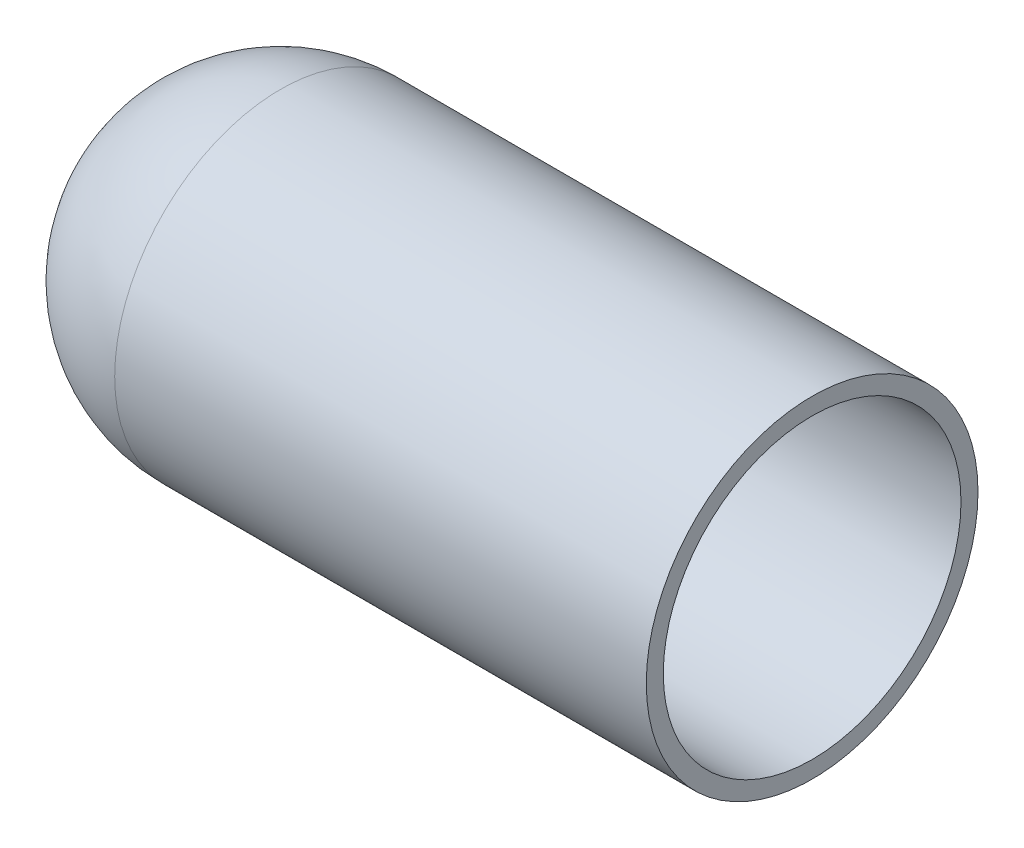
ISO-10303-21;
HEADER;
FILE_DESCRIPTION(('STEP AP214'),'2;1');
FILE_NAME('part.step','',(''),(''),'','','');
FILE_SCHEMA(('AUTOMOTIVE_DESIGN { 1 0 10303 214 1 1 1 1 }'));
ENDSEC;
DATA;
#1=APPLICATION_CONTEXT('core data for automotive mechanical design processes');
#2=APPLICATION_PROTOCOL_DEFINITION('international standard','automotive_design',2000,#1);
#3=PRODUCT_CONTEXT('',#1,'mechanical');
#4=PRODUCT('Part','Part','',(#3));
#5=PRODUCT_RELATED_PRODUCT_CATEGORY('part','',(#4));
#6=PRODUCT_DEFINITION_FORMATION('','',#4);
#7=PRODUCT_DEFINITION_CONTEXT('part definition',#1,'design');
#8=PRODUCT_DEFINITION('design','',#6,#7);
#9=PRODUCT_DEFINITION_SHAPE('','',#8);
#10=(LENGTH_UNIT() NAMED_UNIT(*) SI_UNIT(.MILLI.,.METRE.));
#11=(NAMED_UNIT(*) PLANE_ANGLE_UNIT() SI_UNIT($,.RADIAN.));
#12=(NAMED_UNIT(*) SI_UNIT($,.STERADIAN.) SOLID_ANGLE_UNIT());
#13=UNCERTAINTY_MEASURE_WITH_UNIT(LENGTH_MEASURE(1.E-05),#10,'distance_accuracy_value','');
#14=(GEOMETRIC_REPRESENTATION_CONTEXT(3) GLOBAL_UNCERTAINTY_ASSIGNED_CONTEXT((#13)) GLOBAL_UNIT_ASSIGNED_CONTEXT((#10,
#11,#12)) REPRESENTATION_CONTEXT('',''));
#15=CARTESIAN_POINT('',(0.,0.,0.));
#16=DIRECTION('',(0.,0.,1.));
#17=DIRECTION('',(1.,0.,0.));
#18=AXIS2_PLACEMENT_3D('',#15,#16,#17);
#19=CARTESIAN_POINT('',(15.0900471736981,0.,-9.75));
#20=DIRECTION('',(1.,0.,0.));
#21=DIRECTION('',(0.,0.,-1.));
#22=AXIS2_PLACEMENT_3D('',#19,#20,#21);
#23=PLANE('',#22);
#24=CARTESIAN_POINT('',(15.0900471736981,0.,0.));
#25=DIRECTION('',(1.,0.,0.));
#26=DIRECTION('',(0.,0.,-1.));
#27=AXIS2_PLACEMENT_3D('',#24,#25,#26);
#28=CIRCLE('',#27,8.75);
#29=CARTESIAN_POINT('',(15.0900471736981,0.,-8.75));
#30=VERTEX_POINT('',#29);
#31=EDGE_CURVE('E41',#30,#30,#28,.F.);
#32=ORIENTED_EDGE('',*,*,#31,.T.);
#33=EDGE_LOOP('',(#32));
#34=FACE_BOUND('',#33,.T.);
#35=CARTESIAN_POINT('',(15.0900471736981,0.,0.));
#36=DIRECTION('',(-1.,0.,0.));
#37=DIRECTION('',(0.,0.,1.));
#38=AXIS2_PLACEMENT_3D('',#35,#36,#37);
#39=CIRCLE('',#38,9.75);
#40=CARTESIAN_POINT('',(15.0900471736981,0.,9.75));
#41=VERTEX_POINT('',#40);
#42=EDGE_CURVE('E10',#41,#41,#39,.T.);
#43=ORIENTED_EDGE('',*,*,#42,.F.);
#44=EDGE_LOOP('',(#43));
#45=FACE_BOUND('',#44,.T.);
#46=ADVANCED_FACE('F31',(#34,#45),#23,.T.);
#47=CARTESIAN_POINT('',(-16.1599528263019,0.,0.));
#48=DIRECTION('',(-1.,0.,0.));
#49=DIRECTION('',(0.,0.,1.));
#50=AXIS2_PLACEMENT_3D('',#47,#48,#49);
#51=CYLINDRICAL_SURFACE('',#50,9.75);
#52=ORIENTED_EDGE('',*,*,#42,.T.);
#53=EDGE_LOOP('',(#52));
#54=FACE_BOUND('',#53,.T.);
#55=CARTESIAN_POINT('',(-16.1599528263019,0.,0.));
#56=DIRECTION('',(-1.,0.,0.));
#57=DIRECTION('',(0.,0.,1.));
#58=AXIS2_PLACEMENT_3D('',#55,#56,#57);
#59=CIRCLE('',#58,9.75);
#60=CARTESIAN_POINT('',(-16.1599528263019,0.,9.75));
#61=VERTEX_POINT('',#60);
#62=EDGE_CURVE('E37',#61,#61,#59,.T.);
#63=ORIENTED_EDGE('',*,*,#62,.F.);
#64=EDGE_LOOP('',(#63));
#65=FACE_BOUND('',#64,.T.);
#66=ADVANCED_FACE('F64',(#54,#65),#51,.T.);
#67=CARTESIAN_POINT('',(-16.1599528263019,0.,0.));
#68=DIRECTION('',(-1.,0.,0.));
#69=DIRECTION('',(0.,0.,-1.));
#70=AXIS2_PLACEMENT_3D('',#67,#68,#69);
#71=SPHERICAL_SURFACE('',#70,9.75);
#72=ORIENTED_EDGE('',*,*,#62,.T.);
#73=EDGE_LOOP('',(#72));
#74=FACE_BOUND('',#73,.T.);
#75=ADVANCED_FACE('F59',(#74),#71,.T.);
#76=CARTESIAN_POINT('',(-16.1599528263019,0.,0.));
#77=DIRECTION('',(-1.,0.,0.));
#78=DIRECTION('',(0.,0.,1.));
#79=AXIS2_PLACEMENT_3D('',#76,#77,#78);
#80=CYLINDRICAL_SURFACE('',#79,8.75);
#81=ORIENTED_EDGE('',*,*,#31,.F.);
#82=EDGE_LOOP('',(#81));
#83=FACE_BOUND('',#82,.T.);
#84=CARTESIAN_POINT('',(-16.1599528263019,0.,0.));
#85=DIRECTION('',(-1.,0.,0.));
#86=DIRECTION('',(0.,0.,1.));
#87=AXIS2_PLACEMENT_3D('',#84,#85,#86);
#88=CIRCLE('',#87,8.75);
#89=CARTESIAN_POINT('',(-16.1599528263019,0.,8.75));
#90=VERTEX_POINT('',#89);
#91=EDGE_CURVE('E45',#90,#90,#88,.T.);
#92=ORIENTED_EDGE('',*,*,#91,.T.);
#93=EDGE_LOOP('',(#92));
#94=FACE_BOUND('',#93,.T.);
#95=ADVANCED_FACE('F51',(#83,#94),#80,.F.);
#96=CARTESIAN_POINT('',(-16.1599528263019,0.,0.));
#97=DIRECTION('',(-1.,0.,0.));
#98=DIRECTION('',(0.,0.,-1.));
#99=AXIS2_PLACEMENT_3D('',#96,#97,#98);
#100=SPHERICAL_SURFACE('',#99,8.75);
#101=ORIENTED_EDGE('',*,*,#91,.F.);
#102=EDGE_LOOP('',(#101));
#103=FACE_BOUND('',#102,.T.);
#104=ADVANCED_FACE('F53',(#103),#100,.F.);
#105=CLOSED_SHELL('',(#46,#66,#75,#95,#104));
#106=MANIFOLD_SOLID_BREP('B2',#105);
#107=ADVANCED_BREP_SHAPE_REPRESENTATION('',(#18,#106),#14);
#108=SHAPE_DEFINITION_REPRESENTATION(#9,#107);
ENDSEC;
END-ISO-10303-21;
